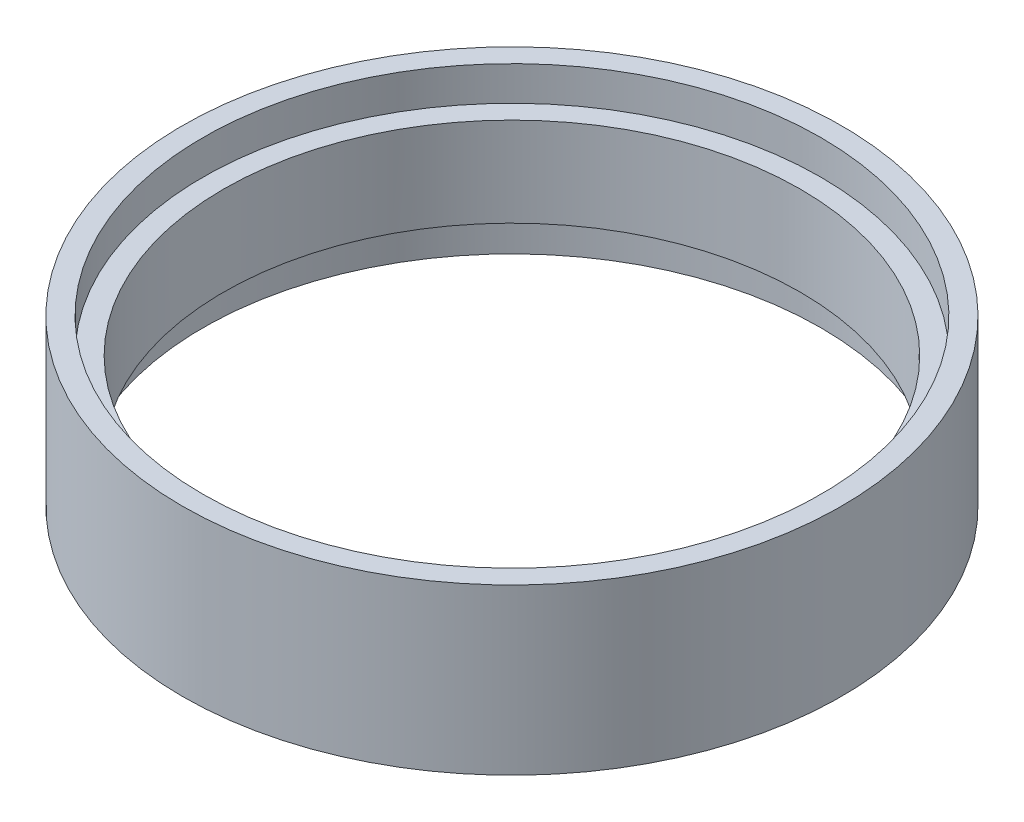
ISO-10303-21;
HEADER;
FILE_DESCRIPTION(('STEP AP214'),'2;1');
FILE_NAME('part.step','',(''),(''),'','','');
FILE_SCHEMA(('AUTOMOTIVE_DESIGN { 1 0 10303 214 1 1 1 1 }'));
ENDSEC;
DATA;
#1=APPLICATION_CONTEXT('core data for automotive mechanical design processes');
#2=APPLICATION_PROTOCOL_DEFINITION('international standard','automotive_design',2000,#1);
#3=PRODUCT_CONTEXT('',#1,'mechanical');
#4=PRODUCT('Part','Part','',(#3));
#5=PRODUCT_RELATED_PRODUCT_CATEGORY('part','',(#4));
#6=PRODUCT_DEFINITION_FORMATION('','',#4);
#7=PRODUCT_DEFINITION_CONTEXT('part definition',#1,'design');
#8=PRODUCT_DEFINITION('design','',#6,#7);
#9=PRODUCT_DEFINITION_SHAPE('','',#8);
#10=(LENGTH_UNIT() NAMED_UNIT(*) SI_UNIT(.MILLI.,.METRE.));
#11=(NAMED_UNIT(*) PLANE_ANGLE_UNIT() SI_UNIT($,.RADIAN.));
#12=(NAMED_UNIT(*) SI_UNIT($,.STERADIAN.) SOLID_ANGLE_UNIT());
#13=UNCERTAINTY_MEASURE_WITH_UNIT(LENGTH_MEASURE(1.E-05),#10,'distance_accuracy_value','');
#14=(GEOMETRIC_REPRESENTATION_CONTEXT(3) GLOBAL_UNCERTAINTY_ASSIGNED_CONTEXT((#13)) GLOBAL_UNIT_ASSIGNED_CONTEXT((#10,
#11,#12)) REPRESENTATION_CONTEXT('',''));
#15=CARTESIAN_POINT('',(0.,0.,0.));
#16=DIRECTION('',(0.,0.,1.));
#17=DIRECTION('',(1.,0.,0.));
#18=AXIS2_PLACEMENT_3D('',#15,#16,#17);
#19=CARTESIAN_POINT('',(0.,24.,0.));
#20=DIRECTION('',(0.,-1.,0.));
#21=DIRECTION('',(0.,0.,-1.));
#22=AXIS2_PLACEMENT_3D('',#19,#20,#21);
#23=CYLINDRICAL_SURFACE('',#22,42.);
#24=CARTESIAN_POINT('',(0.,19.,0.));
#25=DIRECTION('',(0.,1.,0.));
#26=DIRECTION('',(0.,0.,1.));
#27=AXIS2_PLACEMENT_3D('',#24,#25,#26);
#28=CIRCLE('',#27,42.);
#29=CARTESIAN_POINT('',(0.,19.,42.));
#30=VERTEX_POINT('',#29);
#31=EDGE_CURVE('E58',#30,#30,#28,.T.);
#32=ORIENTED_EDGE('',*,*,#31,.T.);
#33=EDGE_LOOP('',(#32));
#34=FACE_BOUND('',#33,.T.);
#35=CARTESIAN_POINT('',(0.,6.,0.));
#36=DIRECTION('',(0.,-1.,0.));
#37=DIRECTION('',(0.,0.,-1.));
#38=AXIS2_PLACEMENT_3D('',#35,#36,#37);
#39=CIRCLE('',#38,42.);
#40=CARTESIAN_POINT('',(0.,6.,-42.));
#41=VERTEX_POINT('',#40);
#42=EDGE_CURVE('E47',#41,#41,#39,.T.);
#43=ORIENTED_EDGE('',*,*,#42,.T.);
#44=EDGE_LOOP('',(#43));
#45=FACE_BOUND('',#44,.T.);
#46=ADVANCED_FACE('F43',(#34,#45),#23,.F.);
#47=CARTESIAN_POINT('',(0.,24.,0.));
#48=DIRECTION('',(0.,1.,0.));
#49=DIRECTION('',(0.,0.,1.));
#50=AXIS2_PLACEMENT_3D('',#47,#48,#49);
#51=PLANE('',#50);
#52=CARTESIAN_POINT('',(0.,24.,0.));
#53=DIRECTION('',(0.,1.,0.));
#54=DIRECTION('',(0.,0.,1.));
#55=AXIS2_PLACEMENT_3D('',#52,#53,#54);
#56=CIRCLE('',#55,45.);
#57=CARTESIAN_POINT('',(0.,24.,45.));
#58=VERTEX_POINT('',#57);
#59=EDGE_CURVE('E61',#58,#58,#56,.T.);
#60=ORIENTED_EDGE('',*,*,#59,.F.);
#61=EDGE_LOOP('',(#60));
#62=FACE_BOUND('',#61,.T.);
#63=CARTESIAN_POINT('',(0.,24.,0.));
#64=DIRECTION('',(0.,1.,0.));
#65=DIRECTION('',(0.,0.,1.));
#66=AXIS2_PLACEMENT_3D('',#63,#64,#65);
#67=CIRCLE('',#66,48.);
#68=CARTESIAN_POINT('',(0.,24.,48.));
#69=VERTEX_POINT('',#68);
#70=EDGE_CURVE('E11',#69,#69,#67,.T.);
#71=ORIENTED_EDGE('',*,*,#70,.T.);
#72=EDGE_LOOP('',(#71));
#73=FACE_BOUND('',#72,.T.);
#74=ADVANCED_FACE('F100',(#62,#73),#51,.T.);
#75=CARTESIAN_POINT('',(0.,0.,0.));
#76=DIRECTION('',(0.,1.,0.));
#77=DIRECTION('',(0.,0.,1.));
#78=AXIS2_PLACEMENT_3D('',#75,#76,#77);
#79=PLANE('',#78);
#80=CARTESIAN_POINT('',(0.,0.,0.));
#81=DIRECTION('',(0.,-1.,0.));
#82=DIRECTION('',(0.,0.,-1.));
#83=AXIS2_PLACEMENT_3D('',#80,#81,#82);
#84=CIRCLE('',#83,45.);
#85=CARTESIAN_POINT('',(0.,0.,-45.));
#86=VERTEX_POINT('',#85);
#87=EDGE_CURVE('E75',#86,#86,#84,.T.);
#88=ORIENTED_EDGE('',*,*,#87,.F.);
#89=EDGE_LOOP('',(#88));
#90=FACE_BOUND('',#89,.T.);
#91=CARTESIAN_POINT('',(0.,0.,0.));
#92=DIRECTION('',(0.,1.,0.));
#93=DIRECTION('',(0.,0.,1.));
#94=AXIS2_PLACEMENT_3D('',#91,#92,#93);
#95=CIRCLE('',#94,48.);
#96=CARTESIAN_POINT('',(0.,0.,48.));
#97=VERTEX_POINT('',#96);
#98=EDGE_CURVE('E52',#97,#97,#95,.T.);
#99=ORIENTED_EDGE('',*,*,#98,.F.);
#100=EDGE_LOOP('',(#99));
#101=FACE_BOUND('',#100,.T.);
#102=ADVANCED_FACE('F105',(#90,#101),#79,.F.);
#103=CARTESIAN_POINT('',(0.,24.,0.));
#104=DIRECTION('',(0.,-1.,0.));
#105=DIRECTION('',(0.,0.,-1.));
#106=AXIS2_PLACEMENT_3D('',#103,#104,#105);
#107=CYLINDRICAL_SURFACE('',#106,48.);
#108=ORIENTED_EDGE('',*,*,#70,.F.);
#109=EDGE_LOOP('',(#108));
#110=FACE_BOUND('',#109,.T.);
#111=ORIENTED_EDGE('',*,*,#98,.T.);
#112=EDGE_LOOP('',(#111));
#113=FACE_BOUND('',#112,.T.);
#114=ADVANCED_FACE('F45',(#110,#113),#107,.T.);
#115=CARTESIAN_POINT('',(0.,19.,0.));
#116=DIRECTION('',(0.,1.,0.));
#117=DIRECTION('',(0.,0.,1.));
#118=AXIS2_PLACEMENT_3D('',#115,#116,#117);
#119=CYLINDRICAL_SURFACE('',#118,45.);
#120=CARTESIAN_POINT('',(0.,19.,0.));
#121=DIRECTION('',(0.,1.,0.));
#122=DIRECTION('',(0.,0.,1.));
#123=AXIS2_PLACEMENT_3D('',#120,#121,#122);
#124=CIRCLE('',#123,45.);
#125=CARTESIAN_POINT('',(0.,19.,45.));
#126=VERTEX_POINT('',#125);
#127=EDGE_CURVE('E65',#126,#126,#124,.T.);
#128=ORIENTED_EDGE('',*,*,#127,.F.);
#129=EDGE_LOOP('',(#128));
#130=FACE_BOUND('',#129,.T.);
#131=ORIENTED_EDGE('',*,*,#59,.T.);
#132=EDGE_LOOP('',(#131));
#133=FACE_BOUND('',#132,.T.);
#134=ADVANCED_FACE('F109',(#130,#133),#119,.F.);
#135=CARTESIAN_POINT('',(0.,19.,0.));
#136=DIRECTION('',(0.,1.,0.));
#137=DIRECTION('',(0.,0.,1.));
#138=AXIS2_PLACEMENT_3D('',#135,#136,#137);
#139=PLANE('',#138);
#140=ORIENTED_EDGE('',*,*,#31,.F.);
#141=EDGE_LOOP('',(#140));
#142=FACE_BOUND('',#141,.T.);
#143=ORIENTED_EDGE('',*,*,#127,.T.);
#144=EDGE_LOOP('',(#143));
#145=FACE_BOUND('',#144,.T.);
#146=ADVANCED_FACE('F96',(#142,#145),#139,.T.);
#147=CARTESIAN_POINT('',(0.,6.,0.));
#148=DIRECTION('',(0.,-1.,0.));
#149=DIRECTION('',(0.,0.,-1.));
#150=AXIS2_PLACEMENT_3D('',#147,#148,#149);
#151=CYLINDRICAL_SURFACE('',#150,45.);
#152=CARTESIAN_POINT('',(0.,6.,0.));
#153=DIRECTION('',(0.,-1.,0.));
#154=DIRECTION('',(0.,0.,-1.));
#155=AXIS2_PLACEMENT_3D('',#152,#153,#154);
#156=CIRCLE('',#155,45.);
#157=CARTESIAN_POINT('',(0.,6.,-45.));
#158=VERTEX_POINT('',#157);
#159=EDGE_CURVE('E79',#158,#158,#156,.T.);
#160=ORIENTED_EDGE('',*,*,#159,.F.);
#161=EDGE_LOOP('',(#160));
#162=FACE_BOUND('',#161,.T.);
#163=ORIENTED_EDGE('',*,*,#87,.T.);
#164=EDGE_LOOP('',(#163));
#165=FACE_BOUND('',#164,.T.);
#166=ADVANCED_FACE('F91',(#162,#165),#151,.F.);
#167=CARTESIAN_POINT('',(0.,6.,0.));
#168=DIRECTION('',(0.,-1.,0.));
#169=DIRECTION('',(0.,0.,-1.));
#170=AXIS2_PLACEMENT_3D('',#167,#168,#169);
#171=PLANE('',#170);
#172=ORIENTED_EDGE('',*,*,#42,.F.);
#173=EDGE_LOOP('',(#172));
#174=FACE_BOUND('',#173,.T.);
#175=ORIENTED_EDGE('',*,*,#159,.T.);
#176=EDGE_LOOP('',(#175));
#177=FACE_BOUND('',#176,.T.);
#178=ADVANCED_FACE('F89',(#174,#177),#171,.T.);
#179=CLOSED_SHELL('',(#46,#74,#102,#114,#134,#146,#166,#178));
#180=MANIFOLD_SOLID_BREP('B2',#179);
#181=ADVANCED_BREP_SHAPE_REPRESENTATION('',(#18,#180),#14);
#182=SHAPE_DEFINITION_REPRESENTATION(#9,#181);
ENDSEC;
END-ISO-10303-21;
